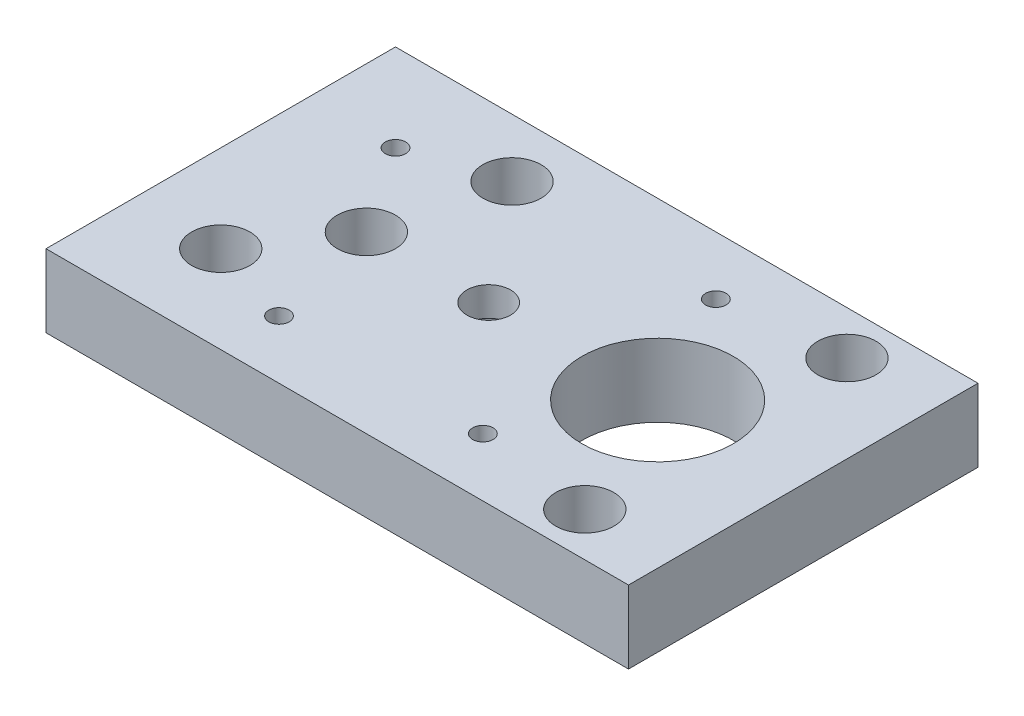
ISO-10303-21;
HEADER;
FILE_DESCRIPTION(('STEP AP214'),'2;1');
FILE_NAME('part.step','',(''),(''),'','','');
FILE_SCHEMA(('AUTOMOTIVE_DESIGN { 1 0 10303 214 1 1 1 1 }'));
ENDSEC;
DATA;
#1=APPLICATION_CONTEXT('core data for automotive mechanical design processes');
#2=APPLICATION_PROTOCOL_DEFINITION('international standard','automotive_design',2000,#1);
#3=PRODUCT_CONTEXT('',#1,'mechanical');
#4=PRODUCT('Part','Part','',(#3));
#5=PRODUCT_RELATED_PRODUCT_CATEGORY('part','',(#4));
#6=PRODUCT_DEFINITION_FORMATION('','',#4);
#7=PRODUCT_DEFINITION_CONTEXT('part definition',#1,'design');
#8=PRODUCT_DEFINITION('design','',#6,#7);
#9=PRODUCT_DEFINITION_SHAPE('','',#8);
#10=(LENGTH_UNIT() NAMED_UNIT(*) SI_UNIT(.MILLI.,.METRE.));
#11=(NAMED_UNIT(*) PLANE_ANGLE_UNIT() SI_UNIT($,.RADIAN.));
#12=(NAMED_UNIT(*) SI_UNIT($,.STERADIAN.) SOLID_ANGLE_UNIT());
#13=UNCERTAINTY_MEASURE_WITH_UNIT(LENGTH_MEASURE(1.E-05),#10,'distance_accuracy_value','');
#14=(GEOMETRIC_REPRESENTATION_CONTEXT(3) GLOBAL_UNCERTAINTY_ASSIGNED_CONTEXT((#13)) GLOBAL_UNIT_ASSIGNED_CONTEXT((#10,
#11,#12)) REPRESENTATION_CONTEXT('',''));
#15=CARTESIAN_POINT('',(0.,0.,0.));
#16=DIRECTION('',(0.,0.,1.));
#17=DIRECTION('',(1.,0.,0.));
#18=AXIS2_PLACEMENT_3D('',#15,#16,#17);
#19=CARTESIAN_POINT('',(6.,0.,2.));
#20=DIRECTION('',(0.,1.,0.));
#21=DIRECTION('',(0.,0.,1.));
#22=AXIS2_PLACEMENT_3D('',#19,#20,#21);
#23=CYLINDRICAL_SURFACE('',#22,0.700000000000001);
#24=CARTESIAN_POINT('',(6.,0.,2.));
#25=DIRECTION('',(0.,1.,0.));
#26=DIRECTION('',(0.,0.,1.));
#27=AXIS2_PLACEMENT_3D('',#24,#25,#26);
#28=CIRCLE('',#27,0.700000000000001);
#29=CARTESIAN_POINT('',(6.,0.,2.7));
#30=VERTEX_POINT('',#29);
#31=EDGE_CURVE('E209',#30,#30,#28,.T.);
#32=ORIENTED_EDGE('',*,*,#31,.F.);
#33=EDGE_LOOP('',(#32));
#34=FACE_BOUND('',#33,.T.);
#35=CARTESIAN_POINT('',(6.,1.,2.));
#36=DIRECTION('',(0.,1.,0.));
#37=DIRECTION('',(0.,0.,1.));
#38=AXIS2_PLACEMENT_3D('',#35,#36,#37);
#39=CIRCLE('',#38,0.700000000000001);
#40=CARTESIAN_POINT('',(6.,1.,2.7));
#41=VERTEX_POINT('',#40);
#42=EDGE_CURVE('E92',#41,#41,#39,.F.);
#43=ORIENTED_EDGE('',*,*,#42,.F.);
#44=EDGE_LOOP('',(#43));
#45=FACE_BOUND('',#44,.T.);
#46=ADVANCED_FACE('F88',(#34,#45),#23,.F.);
#47=CARTESIAN_POINT('',(3.,0.,9.));
#48=DIRECTION('',(0.,1.,0.));
#49=DIRECTION('',(0.,0.,1.));
#50=AXIS2_PLACEMENT_3D('',#47,#48,#49);
#51=CYLINDRICAL_SURFACE('',#50,0.700000000000001);
#52=CARTESIAN_POINT('',(3.,0.,9.));
#53=DIRECTION('',(0.,1.,0.));
#54=DIRECTION('',(0.,0.,1.));
#55=AXIS2_PLACEMENT_3D('',#52,#53,#54);
#56=CIRCLE('',#55,0.700000000000001);
#57=CARTESIAN_POINT('',(3.,0.,9.7));
#58=VERTEX_POINT('',#57);
#59=EDGE_CURVE('E206',#58,#58,#56,.T.);
#60=ORIENTED_EDGE('',*,*,#59,.F.);
#61=EDGE_LOOP('',(#60));
#62=FACE_BOUND('',#61,.T.);
#63=CARTESIAN_POINT('',(3.,1.,9.));
#64=DIRECTION('',(0.,1.,0.));
#65=DIRECTION('',(0.,0.,1.));
#66=AXIS2_PLACEMENT_3D('',#63,#64,#65);
#67=CIRCLE('',#66,0.700000000000001);
#68=CARTESIAN_POINT('',(3.,1.,9.7));
#69=VERTEX_POINT('',#68);
#70=EDGE_CURVE('E177',#69,#69,#67,.F.);
#71=ORIENTED_EDGE('',*,*,#70,.F.);
#72=EDGE_LOOP('',(#71));
#73=FACE_BOUND('',#72,.T.);
#74=ADVANCED_FACE('F252',(#62,#73),#51,.F.);
#75=CARTESIAN_POINT('',(17.,0.,1.5));
#76=DIRECTION('',(0.,1.,0.));
#77=DIRECTION('',(0.,0.,1.));
#78=AXIS2_PLACEMENT_3D('',#75,#76,#77);
#79=CYLINDRICAL_SURFACE('',#78,0.699999999999998);
#80=CARTESIAN_POINT('',(17.,0.,1.5));
#81=DIRECTION('',(0.,1.,0.));
#82=DIRECTION('',(0.,0.,1.));
#83=AXIS2_PLACEMENT_3D('',#80,#81,#82);
#84=CIRCLE('',#83,0.699999999999998);
#85=CARTESIAN_POINT('',(17.,0.,2.2));
#86=VERTEX_POINT('',#85);
#87=EDGE_CURVE('E198',#86,#86,#84,.T.);
#88=ORIENTED_EDGE('',*,*,#87,.F.);
#89=EDGE_LOOP('',(#88));
#90=FACE_BOUND('',#89,.T.);
#91=CARTESIAN_POINT('',(17.,1.,1.5));
#92=DIRECTION('',(0.,1.,0.));
#93=DIRECTION('',(0.,0.,1.));
#94=AXIS2_PLACEMENT_3D('',#91,#92,#93);
#95=CIRCLE('',#94,0.699999999999998);
#96=CARTESIAN_POINT('',(17.,1.,2.2));
#97=VERTEX_POINT('',#96);
#98=EDGE_CURVE('E174',#97,#97,#95,.F.);
#99=ORIENTED_EDGE('',*,*,#98,.F.);
#100=EDGE_LOOP('',(#99));
#101=FACE_BOUND('',#100,.T.);
#102=ADVANCED_FACE('F258',(#90,#101),#79,.F.);
#103=CARTESIAN_POINT('',(17.,0.,10.5));
#104=DIRECTION('',(0.,1.,0.));
#105=DIRECTION('',(0.,0.,1.));
#106=AXIS2_PLACEMENT_3D('',#103,#104,#105);
#107=CYLINDRICAL_SURFACE('',#106,0.699999999999998);
#108=CARTESIAN_POINT('',(17.,0.,10.5));
#109=DIRECTION('',(0.,1.,0.));
#110=DIRECTION('',(0.,0.,1.));
#111=AXIS2_PLACEMENT_3D('',#108,#109,#110);
#112=CIRCLE('',#111,0.699999999999998);
#113=CARTESIAN_POINT('',(17.,0.,11.2));
#114=VERTEX_POINT('',#113);
#115=EDGE_CURVE('E195',#114,#114,#112,.T.);
#116=ORIENTED_EDGE('',*,*,#115,.F.);
#117=EDGE_LOOP('',(#116));
#118=FACE_BOUND('',#117,.T.);
#119=CARTESIAN_POINT('',(17.,1.,10.5));
#120=DIRECTION('',(0.,1.,0.));
#121=DIRECTION('',(0.,0.,1.));
#122=AXIS2_PLACEMENT_3D('',#119,#120,#121);
#123=CIRCLE('',#122,0.699999999999998);
#124=CARTESIAN_POINT('',(17.,1.,11.2));
#125=VERTEX_POINT('',#124);
#126=EDGE_CURVE('E171',#125,#125,#123,.F.);
#127=ORIENTED_EDGE('',*,*,#126,.F.);
#128=EDGE_LOOP('',(#127));
#129=FACE_BOUND('',#128,.T.);
#130=ADVANCED_FACE('F289',(#118,#129),#107,.F.);
#131=CARTESIAN_POINT('',(0.,2.5,0.));
#132=DIRECTION('',(0.,-1.,0.));
#133=DIRECTION('',(0.,0.,-1.));
#134=AXIS2_PLACEMENT_3D('',#131,#132,#133);
#135=PLANE('',#134);
#136=CARTESIAN_POINT('',(17.,2.5,1.5));
#137=DIRECTION('',(0.,1.,0.));
#138=DIRECTION('',(0.,0.,1.));
#139=AXIS2_PLACEMENT_3D('',#136,#137,#138);
#140=CIRCLE('',#139,1.);
#141=CARTESIAN_POINT('',(17.,2.5,2.5));
#142=VERTEX_POINT('',#141);
#143=EDGE_CURVE('E536',#142,#142,#140,.T.);
#144=ORIENTED_EDGE('',*,*,#143,.F.);
#145=EDGE_LOOP('',(#144));
#146=FACE_BOUND('',#145,.T.);
#147=CARTESIAN_POINT('',(17.,2.5,10.5));
#148=DIRECTION('',(0.,1.,0.));
#149=DIRECTION('',(0.,0.,1.));
#150=AXIS2_PLACEMENT_3D('',#147,#148,#149);
#151=CIRCLE('',#150,1.);
#152=CARTESIAN_POINT('',(17.,2.5,11.5));
#153=VERTEX_POINT('',#152);
#154=EDGE_CURVE('E542',#153,#153,#151,.T.);
#155=ORIENTED_EDGE('',*,*,#154,.F.);
#156=EDGE_LOOP('',(#155));
#157=FACE_BOUND('',#156,.T.);
#158=CARTESIAN_POINT('',(3.,2.5,9.));
#159=DIRECTION('',(0.,1.,0.));
#160=DIRECTION('',(0.,0.,1.));
#161=AXIS2_PLACEMENT_3D('',#158,#159,#160);
#162=CIRCLE('',#161,1.);
#163=CARTESIAN_POINT('',(3.,2.5,10.));
#164=VERTEX_POINT('',#163);
#165=EDGE_CURVE('E499',#164,#164,#162,.T.);
#166=ORIENTED_EDGE('',*,*,#165,.F.);
#167=EDGE_LOOP('',(#166));
#168=FACE_BOUND('',#167,.T.);
#169=CARTESIAN_POINT('',(6.,2.5,2.));
#170=DIRECTION('',(0.,1.,0.));
#171=DIRECTION('',(0.,0.,1.));
#172=AXIS2_PLACEMENT_3D('',#169,#170,#171);
#173=CIRCLE('',#172,1.);
#174=CARTESIAN_POINT('',(6.,2.5,3.));
#175=VERTEX_POINT('',#174);
#176=EDGE_CURVE('E497',#175,#175,#173,.T.);
#177=ORIENTED_EDGE('',*,*,#176,.F.);
#178=EDGE_LOOP('',(#177));
#179=FACE_BOUND('',#178,.T.);
#180=CARTESIAN_POINT('',(6.,2.5,10.));
#181=DIRECTION('',(0.,1.,0.));
#182=DIRECTION('',(0.,0.,1.));
#183=AXIS2_PLACEMENT_3D('',#180,#181,#182);
#184=CIRCLE('',#183,0.35);
#185=CARTESIAN_POINT('',(6.,2.5,10.35));
#186=VERTEX_POINT('',#185);
#187=EDGE_CURVE('E199',#186,#186,#184,.T.);
#188=ORIENTED_EDGE('',*,*,#187,.F.);
#189=EDGE_LOOP('',(#188));
#190=FACE_BOUND('',#189,.T.);
#191=CARTESIAN_POINT('',(3.,2.5,3.));
#192=DIRECTION('',(0.,1.,0.));
#193=DIRECTION('',(0.,0.,1.));
#194=AXIS2_PLACEMENT_3D('',#191,#192,#193);
#195=CIRCLE('',#194,0.35);
#196=CARTESIAN_POINT('',(3.,2.5,3.35));
#197=VERTEX_POINT('',#196);
#198=EDGE_CURVE('E205',#197,#197,#195,.T.);
#199=ORIENTED_EDGE('',*,*,#198,.F.);
#200=EDGE_LOOP('',(#199));
#201=FACE_BOUND('',#200,.T.);
#202=CARTESIAN_POINT('',(13.,2.5,2.));
#203=DIRECTION('',(0.,1.,0.));
#204=DIRECTION('',(0.,0.,1.));
#205=AXIS2_PLACEMENT_3D('',#202,#203,#204);
#206=CIRCLE('',#205,0.350000000000001);
#207=CARTESIAN_POINT('',(13.,2.5,2.35));
#208=VERTEX_POINT('',#207);
#209=EDGE_CURVE('E512',#208,#208,#206,.T.);
#210=ORIENTED_EDGE('',*,*,#209,.F.);
#211=EDGE_LOOP('',(#210));
#212=FACE_BOUND('',#211,.T.);
#213=CARTESIAN_POINT('',(13.,2.5,10.));
#214=DIRECTION('',(0.,1.,0.));
#215=DIRECTION('',(0.,0.,1.));
#216=AXIS2_PLACEMENT_3D('',#213,#214,#215);
#217=CIRCLE('',#216,0.350000000000001);
#218=CARTESIAN_POINT('',(13.,2.5,10.35));
#219=VERTEX_POINT('',#218);
#220=EDGE_CURVE('E186',#219,#219,#217,.T.);
#221=ORIENTED_EDGE('',*,*,#220,.F.);
#222=EDGE_LOOP('',(#221));
#223=FACE_BOUND('',#222,.T.);
#224=DIRECTION('',(1.,0.,0.));
#225=VECTOR('',#224,1.);
#226=CARTESIAN_POINT('',(0.,2.5,0.));
#227=LINE('',#226,#225);
#228=CARTESIAN_POINT('',(0.,2.5,0.));
#229=VERTEX_POINT('',#228);
#230=CARTESIAN_POINT('',(20.,2.5,0.));
#231=VERTEX_POINT('',#230);
#232=EDGE_CURVE('E154',#229,#231,#227,.T.);
#233=ORIENTED_EDGE('',*,*,#232,.F.);
#234=DIRECTION('',(0.,0.,1.));
#235=VECTOR('',#234,1.);
#236=CARTESIAN_POINT('',(0.,2.5,0.));
#237=LINE('',#236,#235);
#238=CARTESIAN_POINT('',(0.,2.5,12.));
#239=VERTEX_POINT('',#238);
#240=EDGE_CURVE('E142',#229,#239,#237,.T.);
#241=ORIENTED_EDGE('',*,*,#240,.T.);
#242=DIRECTION('',(1.,0.,0.));
#243=VECTOR('',#242,1.);
#244=CARTESIAN_POINT('',(0.,2.5,12.));
#245=LINE('',#244,#243);
#246=CARTESIAN_POINT('',(20.,2.5,12.));
#247=VERTEX_POINT('',#246);
#248=EDGE_CURVE('E136',#239,#247,#245,.T.);
#249=ORIENTED_EDGE('',*,*,#248,.T.);
#250=DIRECTION('',(0.,0.,1.));
#251=VECTOR('',#250,1.);
#252=CARTESIAN_POINT('',(20.,2.5,0.));
#253=LINE('',#252,#251);
#254=EDGE_CURVE('E141',#231,#247,#253,.T.);
#255=ORIENTED_EDGE('',*,*,#254,.F.);
#256=EDGE_LOOP('',(#233,#241,#249,#255));
#257=FACE_BOUND('',#256,.T.);
#258=CARTESIAN_POINT('',(15.,2.5,6.));
#259=DIRECTION('',(0.,1.,0.));
#260=DIRECTION('',(0.,0.,1.));
#261=AXIS2_PLACEMENT_3D('',#258,#259,#260);
#262=CIRCLE('',#261,2.6);
#263=CARTESIAN_POINT('',(15.,2.5,8.6));
#264=VERTEX_POINT('',#263);
#265=EDGE_CURVE('E227',#264,#264,#262,.T.);
#266=ORIENTED_EDGE('',*,*,#265,.F.);
#267=EDGE_LOOP('',(#266));
#268=FACE_BOUND('',#267,.T.);
#269=CARTESIAN_POINT('',(5.,2.5,6.));
#270=DIRECTION('',(0.,1.,0.));
#271=DIRECTION('',(0.,0.,1.));
#272=AXIS2_PLACEMENT_3D('',#269,#270,#271);
#273=CIRCLE('',#272,1.);
#274=CARTESIAN_POINT('',(5.,2.5,7.));
#275=VERTEX_POINT('',#274);
#276=EDGE_CURVE('E221',#275,#275,#273,.T.);
#277=ORIENTED_EDGE('',*,*,#276,.F.);
#278=EDGE_LOOP('',(#277));
#279=FACE_BOUND('',#278,.T.);
#280=CARTESIAN_POINT('',(9.2,2.5,6.));
#281=DIRECTION('',(0.,-1.,0.));
#282=DIRECTION('',(0.,0.,-1.));
#283=AXIS2_PLACEMENT_3D('',#280,#281,#282);
#284=CIRCLE('',#283,0.75);
#285=CARTESIAN_POINT('',(9.2,2.5,5.25));
#286=VERTEX_POINT('',#285);
#287=EDGE_CURVE('E214',#286,#286,#284,.T.);
#288=ORIENTED_EDGE('',*,*,#287,.T.);
#289=EDGE_LOOP('',(#288));
#290=FACE_BOUND('',#289,.T.);
#291=ADVANCED_FACE('F139',(#146,#157,#168,#179,#190,#201,#212,#223,#257,#268,#279,#290),#135,.F.);
#292=CARTESIAN_POINT('',(0.,0.,0.));
#293=DIRECTION('',(0.,-1.,0.));
#294=DIRECTION('',(0.,0.,-1.));
#295=AXIS2_PLACEMENT_3D('',#292,#293,#294);
#296=PLANE('',#295);
#297=CARTESIAN_POINT('',(6.,0.,10.));
#298=DIRECTION('',(0.,1.,0.));
#299=DIRECTION('',(0.,0.,1.));
#300=AXIS2_PLACEMENT_3D('',#297,#298,#299);
#301=CIRCLE('',#300,0.35);
#302=CARTESIAN_POINT('',(6.,0.,10.35));
#303=VERTEX_POINT('',#302);
#304=EDGE_CURVE('E202',#303,#303,#301,.T.);
#305=ORIENTED_EDGE('',*,*,#304,.T.);
#306=EDGE_LOOP('',(#305));
#307=FACE_BOUND('',#306,.T.);
#308=ORIENTED_EDGE('',*,*,#115,.T.);
#309=EDGE_LOOP('',(#308));
#310=FACE_BOUND('',#309,.T.);
#311=ORIENTED_EDGE('',*,*,#87,.T.);
#312=EDGE_LOOP('',(#311));
#313=FACE_BOUND('',#312,.T.);
#314=ORIENTED_EDGE('',*,*,#59,.T.);
#315=EDGE_LOOP('',(#314));
#316=FACE_BOUND('',#315,.T.);
#317=CARTESIAN_POINT('',(3.,0.,3.));
#318=DIRECTION('',(0.,1.,0.));
#319=DIRECTION('',(0.,0.,1.));
#320=AXIS2_PLACEMENT_3D('',#317,#318,#319);
#321=CIRCLE('',#320,0.35);
#322=CARTESIAN_POINT('',(3.,0.,3.35));
#323=VERTEX_POINT('',#322);
#324=EDGE_CURVE('E509',#323,#323,#321,.T.);
#325=ORIENTED_EDGE('',*,*,#324,.T.);
#326=EDGE_LOOP('',(#325));
#327=FACE_BOUND('',#326,.T.);
#328=CARTESIAN_POINT('',(13.,0.,2.));
#329=DIRECTION('',(0.,1.,0.));
#330=DIRECTION('',(0.,0.,1.));
#331=AXIS2_PLACEMENT_3D('',#328,#329,#330);
#332=CIRCLE('',#331,0.350000000000001);
#333=CARTESIAN_POINT('',(13.,0.,2.35));
#334=VERTEX_POINT('',#333);
#335=EDGE_CURVE('E191',#334,#334,#332,.T.);
#336=ORIENTED_EDGE('',*,*,#335,.T.);
#337=EDGE_LOOP('',(#336));
#338=FACE_BOUND('',#337,.T.);
#339=CARTESIAN_POINT('',(13.,0.,10.));
#340=DIRECTION('',(0.,1.,0.));
#341=DIRECTION('',(0.,0.,1.));
#342=AXIS2_PLACEMENT_3D('',#339,#340,#341);
#343=CIRCLE('',#342,0.350000000000001);
#344=CARTESIAN_POINT('',(13.,0.,10.35));
#345=VERTEX_POINT('',#344);
#346=EDGE_CURVE('E182',#345,#345,#343,.T.);
#347=ORIENTED_EDGE('',*,*,#346,.T.);
#348=EDGE_LOOP('',(#347));
#349=FACE_BOUND('',#348,.T.);
#350=ORIENTED_EDGE('',*,*,#31,.T.);
#351=EDGE_LOOP('',(#350));
#352=FACE_BOUND('',#351,.T.);
#353=CARTESIAN_POINT('',(15.,0.,6.));
#354=DIRECTION('',(0.,1.,0.));
#355=DIRECTION('',(0.,0.,1.));
#356=AXIS2_PLACEMENT_3D('',#353,#354,#355);
#357=CIRCLE('',#356,2.6);
#358=CARTESIAN_POINT('',(15.,0.,8.6));
#359=VERTEX_POINT('',#358);
#360=EDGE_CURVE('E224',#359,#359,#357,.T.);
#361=ORIENTED_EDGE('',*,*,#360,.T.);
#362=EDGE_LOOP('',(#361));
#363=FACE_BOUND('',#362,.T.);
#364=DIRECTION('',(1.,0.,0.));
#365=VECTOR('',#364,1.);
#366=CARTESIAN_POINT('',(0.,0.,0.));
#367=LINE('',#366,#365);
#368=CARTESIAN_POINT('',(0.,0.,0.));
#369=VERTEX_POINT('',#368);
#370=CARTESIAN_POINT('',(20.,0.,0.));
#371=VERTEX_POINT('',#370);
#372=EDGE_CURVE('E160',#369,#371,#367,.T.);
#373=ORIENTED_EDGE('',*,*,#372,.T.);
#374=DIRECTION('',(0.,0.,1.));
#375=VECTOR('',#374,1.);
#376=CARTESIAN_POINT('',(20.,0.,0.));
#377=LINE('',#376,#375);
#378=CARTESIAN_POINT('',(20.,0.,12.));
#379=VERTEX_POINT('',#378);
#380=EDGE_CURVE('E163',#371,#379,#377,.T.);
#381=ORIENTED_EDGE('',*,*,#380,.T.);
#382=DIRECTION('',(1.,0.,0.));
#383=VECTOR('',#382,1.);
#384=CARTESIAN_POINT('',(0.,0.,12.));
#385=LINE('',#384,#383);
#386=CARTESIAN_POINT('',(0.,0.,12.));
#387=VERTEX_POINT('',#386);
#388=EDGE_CURVE('E149',#387,#379,#385,.T.);
#389=ORIENTED_EDGE('',*,*,#388,.F.);
#390=DIRECTION('',(0.,0.,1.));
#391=VECTOR('',#390,1.);
#392=CARTESIAN_POINT('',(0.,0.,0.));
#393=LINE('',#392,#391);
#394=EDGE_CURVE('E123',#369,#387,#393,.T.);
#395=ORIENTED_EDGE('',*,*,#394,.F.);
#396=EDGE_LOOP('',(#373,#381,#389,#395));
#397=FACE_BOUND('',#396,.T.);
#398=CARTESIAN_POINT('',(9.2,0.,6.));
#399=DIRECTION('',(0.,1.,0.));
#400=DIRECTION('',(0.,0.,1.));
#401=AXIS2_PLACEMENT_3D('',#398,#399,#400);
#402=CIRCLE('',#401,1.6);
#403=CARTESIAN_POINT('',(9.2,0.,7.6));
#404=VERTEX_POINT('',#403);
#405=EDGE_CURVE('E164',#404,#404,#402,.T.);
#406=ORIENTED_EDGE('',*,*,#405,.T.);
#407=EDGE_LOOP('',(#406));
#408=FACE_BOUND('',#407,.T.);
#409=CARTESIAN_POINT('',(5.,0.,6.));
#410=DIRECTION('',(0.,1.,0.));
#411=DIRECTION('',(0.,0.,1.));
#412=AXIS2_PLACEMENT_3D('',#409,#410,#411);
#413=CIRCLE('',#412,1.);
#414=CARTESIAN_POINT('',(5.,0.,7.));
#415=VERTEX_POINT('',#414);
#416=EDGE_CURVE('E218',#415,#415,#413,.T.);
#417=ORIENTED_EDGE('',*,*,#416,.T.);
#418=EDGE_LOOP('',(#417));
#419=FACE_BOUND('',#418,.T.);
#420=ADVANCED_FACE('F234',(#307,#310,#313,#316,#327,#338,#349,#352,#363,#397,#408,#419),#296,.T.);
#421=CARTESIAN_POINT('',(0.,2.5,0.));
#422=DIRECTION('',(0.,0.,-1.));
#423=DIRECTION('',(-1.,0.,0.));
#424=AXIS2_PLACEMENT_3D('',#421,#422,#423);
#425=PLANE('',#424);
#426=ORIENTED_EDGE('',*,*,#372,.F.);
#427=DIRECTION('',(0.,-1.,0.));
#428=VECTOR('',#427,1.);
#429=CARTESIAN_POINT('',(0.,2.5,0.));
#430=LINE('',#429,#428);
#431=EDGE_CURVE('E98',#229,#369,#430,.T.);
#432=ORIENTED_EDGE('',*,*,#431,.F.);
#433=ORIENTED_EDGE('',*,*,#232,.T.);
#434=DIRECTION('',(0.,-1.,0.));
#435=VECTOR('',#434,1.);
#436=CARTESIAN_POINT('',(20.,2.5,0.));
#437=LINE('',#436,#435);
#438=EDGE_CURVE('E131',#231,#371,#437,.T.);
#439=ORIENTED_EDGE('',*,*,#438,.T.);
#440=EDGE_LOOP('',(#426,#432,#433,#439));
#441=FACE_BOUND('',#440,.T.);
#442=ADVANCED_FACE('F90',(#441),#425,.T.);
#443=CARTESIAN_POINT('',(0.,2.5,0.));
#444=DIRECTION('',(1.,0.,0.));
#445=DIRECTION('',(0.,0.,-1.));
#446=AXIS2_PLACEMENT_3D('',#443,#444,#445);
#447=PLANE('',#446);
#448=ORIENTED_EDGE('',*,*,#394,.T.);
#449=DIRECTION('',(0.,-1.,0.));
#450=VECTOR('',#449,1.);
#451=CARTESIAN_POINT('',(0.,2.5,12.));
#452=LINE('',#451,#450);
#453=EDGE_CURVE('E151',#239,#387,#452,.T.);
#454=ORIENTED_EDGE('',*,*,#453,.F.);
#455=ORIENTED_EDGE('',*,*,#240,.F.);
#456=ORIENTED_EDGE('',*,*,#431,.T.);
#457=EDGE_LOOP('',(#448,#454,#455,#456));
#458=FACE_BOUND('',#457,.T.);
#459=ADVANCED_FACE('F288',(#458),#447,.F.);
#460=CARTESIAN_POINT('',(0.,2.5,12.));
#461=DIRECTION('',(0.,0.,-1.));
#462=DIRECTION('',(-1.,0.,0.));
#463=AXIS2_PLACEMENT_3D('',#460,#461,#462);
#464=PLANE('',#463);
#465=ORIENTED_EDGE('',*,*,#388,.T.);
#466=DIRECTION('',(0.,-1.,0.));
#467=VECTOR('',#466,1.);
#468=CARTESIAN_POINT('',(20.,2.5,12.));
#469=LINE('',#468,#467);
#470=EDGE_CURVE('E146',#247,#379,#469,.T.);
#471=ORIENTED_EDGE('',*,*,#470,.F.);
#472=ORIENTED_EDGE('',*,*,#248,.F.);
#473=ORIENTED_EDGE('',*,*,#453,.T.);
#474=EDGE_LOOP('',(#465,#471,#472,#473));
#475=FACE_BOUND('',#474,.T.);
#476=ADVANCED_FACE('F147',(#475),#464,.F.);
#477=CARTESIAN_POINT('',(20.,2.5,0.));
#478=DIRECTION('',(1.,0.,0.));
#479=DIRECTION('',(0.,0.,-1.));
#480=AXIS2_PLACEMENT_3D('',#477,#478,#479);
#481=PLANE('',#480);
#482=ORIENTED_EDGE('',*,*,#380,.F.);
#483=ORIENTED_EDGE('',*,*,#438,.F.);
#484=ORIENTED_EDGE('',*,*,#254,.T.);
#485=ORIENTED_EDGE('',*,*,#470,.T.);
#486=EDGE_LOOP('',(#482,#483,#484,#485));
#487=FACE_BOUND('',#486,.T.);
#488=ADVANCED_FACE('F153',(#487),#481,.T.);
#489=CARTESIAN_POINT('',(9.2,2.5,6.));
#490=DIRECTION('',(0.,-1.,0.));
#491=DIRECTION('',(0.,0.,-1.));
#492=AXIS2_PLACEMENT_3D('',#489,#490,#491);
#493=CYLINDRICAL_SURFACE('',#492,1.6);
#494=CARTESIAN_POINT('',(9.2,1.5,6.));
#495=DIRECTION('',(0.,-1.,0.));
#496=DIRECTION('',(0.,0.,-1.));
#497=AXIS2_PLACEMENT_3D('',#494,#495,#496);
#498=CIRCLE('',#497,1.6);
#499=CARTESIAN_POINT('',(9.2,1.5,4.4));
#500=VERTEX_POINT('',#499);
#501=EDGE_CURVE('E12',#500,#500,#498,.T.);
#502=ORIENTED_EDGE('',*,*,#501,.F.);
#503=EDGE_LOOP('',(#502));
#504=FACE_BOUND('',#503,.T.);
#505=ORIENTED_EDGE('',*,*,#405,.F.);
#506=EDGE_LOOP('',(#505));
#507=FACE_BOUND('',#506,.T.);
#508=ADVANCED_FACE('F237',(#504,#507),#493,.F.);
#509=CARTESIAN_POINT('',(15.,2.5,6.));
#510=DIRECTION('',(0.,-1.,0.));
#511=DIRECTION('',(0.,0.,-1.));
#512=AXIS2_PLACEMENT_3D('',#509,#510,#511);
#513=CYLINDRICAL_SURFACE('',#512,2.6);
#514=ORIENTED_EDGE('',*,*,#265,.T.);
#515=EDGE_LOOP('',(#514));
#516=FACE_BOUND('',#515,.T.);
#517=ORIENTED_EDGE('',*,*,#360,.F.);
#518=EDGE_LOOP('',(#517));
#519=FACE_BOUND('',#518,.T.);
#520=ADVANCED_FACE('F239',(#516,#519),#513,.F.);
#521=CARTESIAN_POINT('',(5.,2.5,6.));
#522=DIRECTION('',(0.,-1.,0.));
#523=DIRECTION('',(0.,0.,-1.));
#524=AXIS2_PLACEMENT_3D('',#521,#522,#523);
#525=CYLINDRICAL_SURFACE('',#524,1.);
#526=ORIENTED_EDGE('',*,*,#276,.T.);
#527=EDGE_LOOP('',(#526));
#528=FACE_BOUND('',#527,.T.);
#529=ORIENTED_EDGE('',*,*,#416,.F.);
#530=EDGE_LOOP('',(#529));
#531=FACE_BOUND('',#530,.T.);
#532=ADVANCED_FACE('F246',(#528,#531),#525,.F.);
#533=CARTESIAN_POINT('',(9.2,1.5,6.));
#534=DIRECTION('',(0.,-1.,0.));
#535=DIRECTION('',(0.,0.,-1.));
#536=AXIS2_PLACEMENT_3D('',#533,#534,#535);
#537=PLANE('',#536);
#538=ORIENTED_EDGE('',*,*,#501,.T.);
#539=EDGE_LOOP('',(#538));
#540=FACE_BOUND('',#539,.T.);
#541=CARTESIAN_POINT('',(9.2,1.5,6.));
#542=DIRECTION('',(0.,-1.,0.));
#543=DIRECTION('',(0.,0.,-1.));
#544=AXIS2_PLACEMENT_3D('',#541,#542,#543);
#545=CIRCLE('',#544,0.75);
#546=CARTESIAN_POINT('',(9.2,1.5,5.25));
#547=VERTEX_POINT('',#546);
#548=EDGE_CURVE('E215',#547,#547,#545,.T.);
#549=ORIENTED_EDGE('',*,*,#548,.F.);
#550=EDGE_LOOP('',(#549));
#551=FACE_BOUND('',#550,.T.);
#552=ADVANCED_FACE('F269',(#540,#551),#537,.T.);
#553=CARTESIAN_POINT('',(9.2,1.5,6.));
#554=DIRECTION('',(0.,1.,0.));
#555=DIRECTION('',(0.,0.,1.));
#556=AXIS2_PLACEMENT_3D('',#553,#554,#555);
#557=CYLINDRICAL_SURFACE('',#556,0.75);
#558=ORIENTED_EDGE('',*,*,#548,.T.);
#559=EDGE_LOOP('',(#558));
#560=FACE_BOUND('',#559,.T.);
#561=ORIENTED_EDGE('',*,*,#287,.F.);
#562=EDGE_LOOP('',(#561));
#563=FACE_BOUND('',#562,.T.);
#564=ADVANCED_FACE('F265',(#560,#563),#557,.F.);
#565=CARTESIAN_POINT('',(13.,0.,10.));
#566=DIRECTION('',(0.,1.,0.));
#567=DIRECTION('',(0.,0.,1.));
#568=AXIS2_PLACEMENT_3D('',#565,#566,#567);
#569=CYLINDRICAL_SURFACE('',#568,0.350000000000001);
#570=ORIENTED_EDGE('',*,*,#346,.F.);
#571=EDGE_LOOP('',(#570));
#572=FACE_BOUND('',#571,.T.);
#573=ORIENTED_EDGE('',*,*,#220,.T.);
#574=EDGE_LOOP('',(#573));
#575=FACE_BOUND('',#574,.T.);
#576=ADVANCED_FACE('F268',(#572,#575),#569,.F.);
#577=CARTESIAN_POINT('',(13.,0.,2.));
#578=DIRECTION('',(0.,1.,0.));
#579=DIRECTION('',(0.,0.,1.));
#580=AXIS2_PLACEMENT_3D('',#577,#578,#579);
#581=CYLINDRICAL_SURFACE('',#580,0.350000000000001);
#582=ORIENTED_EDGE('',*,*,#335,.F.);
#583=EDGE_LOOP('',(#582));
#584=FACE_BOUND('',#583,.T.);
#585=ORIENTED_EDGE('',*,*,#209,.T.);
#586=EDGE_LOOP('',(#585));
#587=FACE_BOUND('',#586,.T.);
#588=ADVANCED_FACE('F346',(#584,#587),#581,.F.);
#589=CARTESIAN_POINT('',(3.,0.,3.));
#590=DIRECTION('',(0.,1.,0.));
#591=DIRECTION('',(0.,0.,1.));
#592=AXIS2_PLACEMENT_3D('',#589,#590,#591);
#593=CYLINDRICAL_SURFACE('',#592,0.35);
#594=ORIENTED_EDGE('',*,*,#324,.F.);
#595=EDGE_LOOP('',(#594));
#596=FACE_BOUND('',#595,.T.);
#597=ORIENTED_EDGE('',*,*,#198,.T.);
#598=EDGE_LOOP('',(#597));
#599=FACE_BOUND('',#598,.T.);
#600=ADVANCED_FACE('F356',(#596,#599),#593,.F.);
#601=CARTESIAN_POINT('',(6.,0.,10.));
#602=DIRECTION('',(0.,1.,0.));
#603=DIRECTION('',(0.,0.,1.));
#604=AXIS2_PLACEMENT_3D('',#601,#602,#603);
#605=CYLINDRICAL_SURFACE('',#604,0.35);
#606=ORIENTED_EDGE('',*,*,#304,.F.);
#607=EDGE_LOOP('',(#606));
#608=FACE_BOUND('',#607,.T.);
#609=ORIENTED_EDGE('',*,*,#187,.T.);
#610=EDGE_LOOP('',(#609));
#611=FACE_BOUND('',#610,.T.);
#612=ADVANCED_FACE('F366',(#608,#611),#605,.F.);
#613=CARTESIAN_POINT('',(17.,1.,10.5));
#614=DIRECTION('',(0.,1.,0.));
#615=DIRECTION('',(0.,0.,1.));
#616=AXIS2_PLACEMENT_3D('',#613,#614,#615);
#617=PLANE('',#616);
#618=CARTESIAN_POINT('',(17.,1.,10.5));
#619=DIRECTION('',(0.,1.,0.));
#620=DIRECTION('',(0.,0.,1.));
#621=AXIS2_PLACEMENT_3D('',#618,#619,#620);
#622=CIRCLE('',#621,1.);
#623=CARTESIAN_POINT('',(17.,1.,11.5));
#624=VERTEX_POINT('',#623);
#625=EDGE_CURVE('E539',#624,#624,#622,.T.);
#626=ORIENTED_EDGE('',*,*,#625,.T.);
#627=EDGE_LOOP('',(#626));
#628=FACE_BOUND('',#627,.T.);
#629=ORIENTED_EDGE('',*,*,#126,.T.);
#630=EDGE_LOOP('',(#629));
#631=FACE_BOUND('',#630,.T.);
#632=ADVANCED_FACE('F375',(#628,#631),#617,.T.);
#633=CARTESIAN_POINT('',(17.,1.,10.5));
#634=DIRECTION('',(0.,1.,0.));
#635=DIRECTION('',(0.,0.,1.));
#636=AXIS2_PLACEMENT_3D('',#633,#634,#635);
#637=CYLINDRICAL_SURFACE('',#636,1.);
#638=ORIENTED_EDGE('',*,*,#625,.F.);
#639=EDGE_LOOP('',(#638));
#640=FACE_BOUND('',#639,.T.);
#641=ORIENTED_EDGE('',*,*,#154,.T.);
#642=EDGE_LOOP('',(#641));
#643=FACE_BOUND('',#642,.T.);
#644=ADVANCED_FACE('F418',(#640,#643),#637,.F.);
#645=CARTESIAN_POINT('',(17.,1.,1.5));
#646=DIRECTION('',(0.,1.,0.));
#647=DIRECTION('',(0.,0.,1.));
#648=AXIS2_PLACEMENT_3D('',#645,#646,#647);
#649=PLANE('',#648);
#650=CARTESIAN_POINT('',(17.,1.,1.5));
#651=DIRECTION('',(0.,1.,0.));
#652=DIRECTION('',(0.,0.,1.));
#653=AXIS2_PLACEMENT_3D('',#650,#651,#652);
#654=CIRCLE('',#653,1.);
#655=CARTESIAN_POINT('',(17.,1.,2.5));
#656=VERTEX_POINT('',#655);
#657=EDGE_CURVE('E533',#656,#656,#654,.T.);
#658=ORIENTED_EDGE('',*,*,#657,.T.);
#659=EDGE_LOOP('',(#658));
#660=FACE_BOUND('',#659,.T.);
#661=ORIENTED_EDGE('',*,*,#98,.T.);
#662=EDGE_LOOP('',(#661));
#663=FACE_BOUND('',#662,.T.);
#664=ADVANCED_FACE('F428',(#660,#663),#649,.T.);
#665=CARTESIAN_POINT('',(17.,1.,1.5));
#666=DIRECTION('',(0.,1.,0.));
#667=DIRECTION('',(0.,0.,1.));
#668=AXIS2_PLACEMENT_3D('',#665,#666,#667);
#669=CYLINDRICAL_SURFACE('',#668,1.);
#670=ORIENTED_EDGE('',*,*,#657,.F.);
#671=EDGE_LOOP('',(#670));
#672=FACE_BOUND('',#671,.T.);
#673=ORIENTED_EDGE('',*,*,#143,.T.);
#674=EDGE_LOOP('',(#673));
#675=FACE_BOUND('',#674,.T.);
#676=ADVANCED_FACE('F438',(#672,#675),#669,.F.);
#677=CARTESIAN_POINT('',(3.,1.,9.));
#678=DIRECTION('',(0.,1.,0.));
#679=DIRECTION('',(0.,0.,1.));
#680=AXIS2_PLACEMENT_3D('',#677,#678,#679);
#681=PLANE('',#680);
#682=CARTESIAN_POINT('',(3.,1.,9.));
#683=DIRECTION('',(0.,1.,0.));
#684=DIRECTION('',(0.,0.,1.));
#685=AXIS2_PLACEMENT_3D('',#682,#683,#684);
#686=CIRCLE('',#685,1.);
#687=CARTESIAN_POINT('',(3.,1.,10.));
#688=VERTEX_POINT('',#687);
#689=EDGE_CURVE('E503',#688,#688,#686,.T.);
#690=ORIENTED_EDGE('',*,*,#689,.T.);
#691=EDGE_LOOP('',(#690));
#692=FACE_BOUND('',#691,.T.);
#693=ORIENTED_EDGE('',*,*,#70,.T.);
#694=EDGE_LOOP('',(#693));
#695=FACE_BOUND('',#694,.T.);
#696=ADVANCED_FACE('F448',(#692,#695),#681,.T.);
#697=CARTESIAN_POINT('',(3.,1.,9.));
#698=DIRECTION('',(0.,1.,0.));
#699=DIRECTION('',(0.,0.,1.));
#700=AXIS2_PLACEMENT_3D('',#697,#698,#699);
#701=CYLINDRICAL_SURFACE('',#700,1.);
#702=ORIENTED_EDGE('',*,*,#689,.F.);
#703=EDGE_LOOP('',(#702));
#704=FACE_BOUND('',#703,.T.);
#705=ORIENTED_EDGE('',*,*,#165,.T.);
#706=EDGE_LOOP('',(#705));
#707=FACE_BOUND('',#706,.T.);
#708=ADVANCED_FACE('F458',(#704,#707),#701,.F.);
#709=CARTESIAN_POINT('',(6.,1.,2.));
#710=DIRECTION('',(0.,1.,0.));
#711=DIRECTION('',(0.,0.,1.));
#712=AXIS2_PLACEMENT_3D('',#709,#710,#711);
#713=PLANE('',#712);
#714=CARTESIAN_POINT('',(6.,1.,2.));
#715=DIRECTION('',(0.,1.,0.));
#716=DIRECTION('',(0.,0.,1.));
#717=AXIS2_PLACEMENT_3D('',#714,#715,#716);
#718=CIRCLE('',#717,1.);
#719=CARTESIAN_POINT('',(6.,1.,3.));
#720=VERTEX_POINT('',#719);
#721=EDGE_CURVE('E175',#720,#720,#718,.T.);
#722=ORIENTED_EDGE('',*,*,#721,.T.);
#723=EDGE_LOOP('',(#722));
#724=FACE_BOUND('',#723,.T.);
#725=ORIENTED_EDGE('',*,*,#42,.T.);
#726=EDGE_LOOP('',(#725));
#727=FACE_BOUND('',#726,.T.);
#728=ADVANCED_FACE('F468',(#724,#727),#713,.T.);
#729=CARTESIAN_POINT('',(6.,1.,2.));
#730=DIRECTION('',(0.,1.,0.));
#731=DIRECTION('',(0.,0.,1.));
#732=AXIS2_PLACEMENT_3D('',#729,#730,#731);
#733=CYLINDRICAL_SURFACE('',#732,1.);
#734=ORIENTED_EDGE('',*,*,#721,.F.);
#735=EDGE_LOOP('',(#734));
#736=FACE_BOUND('',#735,.T.);
#737=ORIENTED_EDGE('',*,*,#176,.T.);
#738=EDGE_LOOP('',(#737));
#739=FACE_BOUND('',#738,.T.);
#740=ADVANCED_FACE('F478',(#736,#739),#733,.F.);
#741=CLOSED_SHELL('',(#46,#74,#102,#130,#291,#420,#442,#459,#476,#488,#508,#520,#532,#552,#564,
#576,#588,#600,#612,#632,#644,#664,#676,#696,#708,#728,#740));
#742=MANIFOLD_SOLID_BREP('B2',#741);
#743=ADVANCED_BREP_SHAPE_REPRESENTATION('',(#18,#742),#14);
#744=SHAPE_DEFINITION_REPRESENTATION(#9,#743);
ENDSEC;
END-ISO-10303-21;
